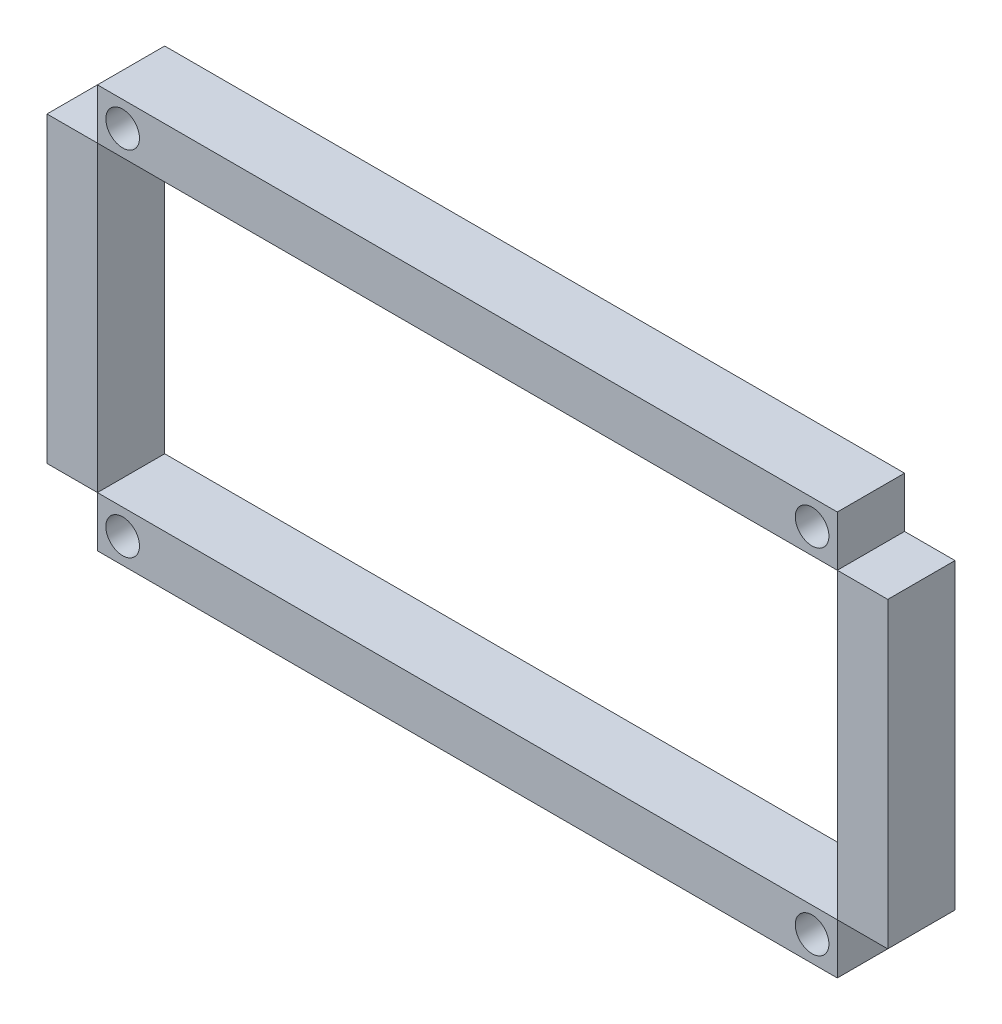
ISO-10303-21;
HEADER;
FILE_DESCRIPTION(('STEP AP214'),'2;1');
FILE_NAME('part.step','',(''),(''),'','','');
FILE_SCHEMA(('AUTOMOTIVE_DESIGN { 1 0 10303 214 1 1 1 1 }'));
ENDSEC;
DATA;
#1=APPLICATION_CONTEXT('core data for automotive mechanical design processes');
#2=APPLICATION_PROTOCOL_DEFINITION('international standard','automotive_design',2000,#1);
#3=PRODUCT_CONTEXT('',#1,'mechanical');
#4=PRODUCT('Part','Part','',(#3));
#5=PRODUCT_RELATED_PRODUCT_CATEGORY('part','',(#4));
#6=PRODUCT_DEFINITION_FORMATION('','',#4);
#7=PRODUCT_DEFINITION_CONTEXT('part definition',#1,'design');
#8=PRODUCT_DEFINITION('design','',#6,#7);
#9=PRODUCT_DEFINITION_SHAPE('','',#8);
#10=(LENGTH_UNIT() NAMED_UNIT(*) SI_UNIT(.MILLI.,.METRE.));
#11=(NAMED_UNIT(*) PLANE_ANGLE_UNIT() SI_UNIT($,.RADIAN.));
#12=(NAMED_UNIT(*) SI_UNIT($,.STERADIAN.) SOLID_ANGLE_UNIT());
#13=UNCERTAINTY_MEASURE_WITH_UNIT(LENGTH_MEASURE(1.E-05),#10,'distance_accuracy_value','');
#14=(GEOMETRIC_REPRESENTATION_CONTEXT(3) GLOBAL_UNCERTAINTY_ASSIGNED_CONTEXT((#13)) GLOBAL_UNIT_ASSIGNED_CONTEXT((#10,
#11,#12)) REPRESENTATION_CONTEXT('',''));
#15=CARTESIAN_POINT('',(0.,0.,0.));
#16=DIRECTION('',(0.,0.,1.));
#17=DIRECTION('',(1.,0.,0.));
#18=AXIS2_PLACEMENT_3D('',#15,#16,#17);
#19=CARTESIAN_POINT('',(380.904830226757,0.,40.));
#20=DIRECTION('',(1.,0.,0.));
#21=DIRECTION('',(0.,0.,-1.));
#22=AXIS2_PLACEMENT_3D('',#19,#20,#21);
#23=PLANE('',#22);
#24=DIRECTION('',(0.,-1.,0.));
#25=VECTOR('',#24,1.);
#26=CARTESIAN_POINT('',(380.904830226757,0.,0.));
#27=LINE('',#26,#25);
#28=CARTESIAN_POINT('',(380.904830226757,-157.632678774636,0.));
#29=VERTEX_POINT('',#28);
#30=CARTESIAN_POINT('',(380.904830226757,-187.632678774636,0.));
#31=VERTEX_POINT('',#30);
#32=EDGE_CURVE('E138',#29,#31,#27,.T.);
#33=ORIENTED_EDGE('',*,*,#32,.F.);
#34=DIRECTION('',(0.,0.,-1.));
#35=VECTOR('',#34,1.);
#36=CARTESIAN_POINT('',(380.904830226757,-157.632678774636,40.));
#37=LINE('',#36,#35);
#38=CARTESIAN_POINT('',(380.904830226757,-157.632678774636,40.));
#39=VERTEX_POINT('',#38);
#40=EDGE_CURVE('E12',#39,#29,#37,.T.);
#41=ORIENTED_EDGE('',*,*,#40,.F.);
#42=DIRECTION('',(0.,-1.,0.));
#43=VECTOR('',#42,1.);
#44=CARTESIAN_POINT('',(380.904830226757,0.,40.));
#45=LINE('',#44,#43);
#46=CARTESIAN_POINT('',(380.904830226757,-187.632678774636,40.));
#47=VERTEX_POINT('',#46);
#48=EDGE_CURVE('E120',#39,#47,#45,.T.);
#49=ORIENTED_EDGE('',*,*,#48,.T.);
#50=DIRECTION('',(0.,0.,-1.));
#51=VECTOR('',#50,1.);
#52=CARTESIAN_POINT('',(380.904830226757,-187.632678774636,40.));
#53=LINE('',#52,#51);
#54=EDGE_CURVE('E97',#47,#31,#53,.T.);
#55=ORIENTED_EDGE('',*,*,#54,.T.);
#56=EDGE_LOOP('',(#33,#41,#49,#55));
#57=FACE_BOUND('',#56,.T.);
#58=ADVANCED_FACE('F56',(#57),#23,.T.);
#59=CARTESIAN_POINT('',(0.,-157.632678774636,40.));
#60=DIRECTION('',(0.,1.,0.));
#61=DIRECTION('',(0.,0.,1.));
#62=AXIS2_PLACEMENT_3D('',#59,#60,#61);
#63=PLANE('',#62);
#64=DIRECTION('',(1.,0.,0.));
#65=VECTOR('',#64,1.);
#66=CARTESIAN_POINT('',(0.,-157.632678774636,0.));
#67=LINE('',#66,#65);
#68=CARTESIAN_POINT('',(-59.0951697732432,-157.632678774636,0.));
#69=VERTEX_POINT('',#68);
#70=EDGE_CURVE('E109',#69,#29,#67,.T.);
#71=ORIENTED_EDGE('',*,*,#70,.F.);
#72=DIRECTION('',(0.,0.,-1.));
#73=VECTOR('',#72,1.);
#74=CARTESIAN_POINT('',(-59.0951697732432,-157.632678774636,40.));
#75=LINE('',#74,#73);
#76=CARTESIAN_POINT('',(-59.0951697732432,-157.632678774636,40.));
#77=VERTEX_POINT('',#76);
#78=EDGE_CURVE('E66',#77,#69,#75,.T.);
#79=ORIENTED_EDGE('',*,*,#78,.F.);
#80=DIRECTION('',(1.,0.,0.));
#81=VECTOR('',#80,1.);
#82=CARTESIAN_POINT('',(0.,-157.632678774636,40.));
#83=LINE('',#82,#81);
#84=EDGE_CURVE('E107',#77,#39,#83,.T.);
#85=ORIENTED_EDGE('',*,*,#84,.T.);
#86=ORIENTED_EDGE('',*,*,#40,.T.);
#87=EDGE_LOOP('',(#71,#79,#85,#86));
#88=FACE_BOUND('',#87,.T.);
#89=ADVANCED_FACE('F105',(#88),#63,.T.);
#90=CARTESIAN_POINT('',(-59.0951697732432,0.,40.));
#91=DIRECTION('',(1.,0.,0.));
#92=DIRECTION('',(0.,0.,-1.));
#93=AXIS2_PLACEMENT_3D('',#90,#91,#92);
#94=PLANE('',#93);
#95=DIRECTION('',(0.,-1.,0.));
#96=VECTOR('',#95,1.);
#97=CARTESIAN_POINT('',(-59.0951697732432,0.,0.));
#98=LINE('',#97,#96);
#99=CARTESIAN_POINT('',(-59.0951697732432,-187.632678774636,0.));
#100=VERTEX_POINT('',#99);
#101=EDGE_CURVE('E143',#69,#100,#98,.T.);
#102=ORIENTED_EDGE('',*,*,#101,.T.);
#103=DIRECTION('',(0.,0.,-1.));
#104=VECTOR('',#103,1.);
#105=CARTESIAN_POINT('',(-59.0951697732432,-187.632678774636,40.));
#106=LINE('',#105,#104);
#107=CARTESIAN_POINT('',(-59.0951697732432,-187.632678774636,40.));
#108=VERTEX_POINT('',#107);
#109=EDGE_CURVE('E113',#108,#100,#106,.T.);
#110=ORIENTED_EDGE('',*,*,#109,.F.);
#111=DIRECTION('',(0.,-1.,0.));
#112=VECTOR('',#111,1.);
#113=CARTESIAN_POINT('',(-59.0951697732432,0.,40.));
#114=LINE('',#113,#112);
#115=EDGE_CURVE('E115',#77,#108,#114,.T.);
#116=ORIENTED_EDGE('',*,*,#115,.F.);
#117=ORIENTED_EDGE('',*,*,#78,.T.);
#118=EDGE_LOOP('',(#102,#110,#116,#117));
#119=FACE_BOUND('',#118,.T.);
#120=ADVANCED_FACE('F116',(#119),#94,.F.);
#121=CARTESIAN_POINT('',(365.904830226757,-172.632678774636,40.));
#122=DIRECTION('',(0.,0.,-1.));
#123=DIRECTION('',(-1.,0.,0.));
#124=AXIS2_PLACEMENT_3D('',#121,#122,#123);
#125=CYLINDRICAL_SURFACE('',#124,9.99999999999998);
#126=CARTESIAN_POINT('',(365.904830226757,-172.632678774636,40.));
#127=DIRECTION('',(0.,0.,1.));
#128=DIRECTION('',(1.,0.,0.));
#129=AXIS2_PLACEMENT_3D('',#126,#127,#128);
#130=CIRCLE('',#129,9.99999999999998);
#131=CARTESIAN_POINT('',(375.904830226757,-172.632678774636,40.));
#132=VERTEX_POINT('',#131);
#133=EDGE_CURVE('E124',#132,#132,#130,.T.);
#134=ORIENTED_EDGE('',*,*,#133,.T.);
#135=EDGE_LOOP('',(#134));
#136=FACE_BOUND('',#135,.T.);
#137=CARTESIAN_POINT('',(365.904830226757,-172.632678774636,0.));
#138=DIRECTION('',(0.,0.,1.));
#139=DIRECTION('',(1.,0.,0.));
#140=AXIS2_PLACEMENT_3D('',#137,#138,#139);
#141=CIRCLE('',#140,9.99999999999998);
#142=CARTESIAN_POINT('',(375.904830226757,-172.632678774636,0.));
#143=VERTEX_POINT('',#142);
#144=EDGE_CURVE('E134',#143,#143,#141,.T.);
#145=ORIENTED_EDGE('',*,*,#144,.F.);
#146=EDGE_LOOP('',(#145));
#147=FACE_BOUND('',#146,.T.);
#148=ADVANCED_FACE('F162',(#136,#147),#125,.F.);
#149=CARTESIAN_POINT('',(-44.0951697732432,-172.632678774636,40.));
#150=DIRECTION('',(0.,0.,-1.));
#151=DIRECTION('',(-1.,0.,0.));
#152=AXIS2_PLACEMENT_3D('',#149,#150,#151);
#153=CYLINDRICAL_SURFACE('',#152,10.);
#154=CARTESIAN_POINT('',(-44.0951697732432,-172.632678774636,40.));
#155=DIRECTION('',(0.,0.,1.));
#156=DIRECTION('',(1.,0.,0.));
#157=AXIS2_PLACEMENT_3D('',#154,#155,#156);
#158=CIRCLE('',#157,10.);
#159=CARTESIAN_POINT('',(-34.0951697732433,-172.632678774636,40.));
#160=VERTEX_POINT('',#159);
#161=EDGE_CURVE('E148',#160,#160,#158,.T.);
#162=ORIENTED_EDGE('',*,*,#161,.T.);
#163=EDGE_LOOP('',(#162));
#164=FACE_BOUND('',#163,.T.);
#165=CARTESIAN_POINT('',(-44.0951697732432,-172.632678774636,0.));
#166=DIRECTION('',(0.,0.,1.));
#167=DIRECTION('',(1.,0.,0.));
#168=AXIS2_PLACEMENT_3D('',#165,#166,#167);
#169=CIRCLE('',#168,10.);
#170=CARTESIAN_POINT('',(-34.0951697732433,-172.632678774636,0.));
#171=VERTEX_POINT('',#170);
#172=EDGE_CURVE('E130',#171,#171,#169,.T.);
#173=ORIENTED_EDGE('',*,*,#172,.F.);
#174=EDGE_LOOP('',(#173));
#175=FACE_BOUND('',#174,.T.);
#176=ADVANCED_FACE('F58',(#164,#175),#153,.F.);
#177=CARTESIAN_POINT('',(0.,-187.632678774636,40.));
#178=DIRECTION('',(0.,1.,0.));
#179=DIRECTION('',(0.,0.,1.));
#180=AXIS2_PLACEMENT_3D('',#177,#178,#179);
#181=PLANE('',#180);
#182=DIRECTION('',(1.,0.,0.));
#183=VECTOR('',#182,1.);
#184=CARTESIAN_POINT('',(0.,-187.632678774636,0.));
#185=LINE('',#184,#183);
#186=EDGE_CURVE('E90',#100,#31,#185,.T.);
#187=ORIENTED_EDGE('',*,*,#186,.T.);
#188=ORIENTED_EDGE('',*,*,#54,.F.);
#189=DIRECTION('',(1.,0.,0.));
#190=VECTOR('',#189,1.);
#191=CARTESIAN_POINT('',(0.,-187.632678774636,40.));
#192=LINE('',#191,#190);
#193=EDGE_CURVE('E74',#108,#47,#192,.T.);
#194=ORIENTED_EDGE('',*,*,#193,.F.);
#195=ORIENTED_EDGE('',*,*,#109,.T.);
#196=EDGE_LOOP('',(#187,#188,#194,#195));
#197=FACE_BOUND('',#196,.T.);
#198=ADVANCED_FACE('F153',(#197),#181,.F.);
#199=CARTESIAN_POINT('',(0.,0.,40.));
#200=DIRECTION('',(0.,0.,1.));
#201=DIRECTION('',(1.,0.,0.));
#202=AXIS2_PLACEMENT_3D('',#199,#200,#201);
#203=PLANE('',#202);
#204=ORIENTED_EDGE('',*,*,#161,.F.);
#205=EDGE_LOOP('',(#204));
#206=FACE_BOUND('',#205,.T.);
#207=ORIENTED_EDGE('',*,*,#133,.F.);
#208=EDGE_LOOP('',(#207));
#209=FACE_BOUND('',#208,.T.);
#210=ORIENTED_EDGE('',*,*,#48,.F.);
#211=ORIENTED_EDGE('',*,*,#84,.F.);
#212=ORIENTED_EDGE('',*,*,#115,.T.);
#213=ORIENTED_EDGE('',*,*,#193,.T.);
#214=EDGE_LOOP('',(#210,#211,#212,#213));
#215=FACE_BOUND('',#214,.T.);
#216=ADVANCED_FACE('F119',(#206,#209,#215),#203,.T.);
#217=CARTESIAN_POINT('',(0.,0.,0.));
#218=DIRECTION('',(0.,0.,1.));
#219=DIRECTION('',(1.,0.,0.));
#220=AXIS2_PLACEMENT_3D('',#217,#218,#219);
#221=PLANE('',#220);
#222=ORIENTED_EDGE('',*,*,#172,.T.);
#223=EDGE_LOOP('',(#222));
#224=FACE_BOUND('',#223,.T.);
#225=ORIENTED_EDGE('',*,*,#144,.T.);
#226=EDGE_LOOP('',(#225));
#227=FACE_BOUND('',#226,.T.);
#228=ORIENTED_EDGE('',*,*,#32,.T.);
#229=ORIENTED_EDGE('',*,*,#186,.F.);
#230=ORIENTED_EDGE('',*,*,#101,.F.);
#231=ORIENTED_EDGE('',*,*,#70,.T.);
#232=EDGE_LOOP('',(#228,#229,#230,#231));
#233=FACE_BOUND('',#232,.T.);
#234=ADVANCED_FACE('F154',(#224,#227,#233),#221,.F.);
#235=CLOSED_SHELL('',(#58,#89,#120,#148,#176,#198,#216,#234));
#236=MANIFOLD_SOLID_BREP('B2',#235);
#237=CARTESIAN_POINT('',(410.904830226757,-1.26721112068732E-13,40.));
#238=DIRECTION('',(1.,0.,0.));
#239=DIRECTION('',(0.,1.,0.));
#240=AXIS2_PLACEMENT_3D('',#237,#238,#239);
#241=PLANE('',#240);
#242=DIRECTION('',(0.,-1.,0.));
#243=VECTOR('',#242,1.);
#244=CARTESIAN_POINT('',(410.904830226757,-1.26721112068732E-13,0.));
#245=LINE('',#244,#243);
#246=CARTESIAN_POINT('',(410.904830226757,22.367321225364,0.));
#247=VERTEX_POINT('',#246);
#248=CARTESIAN_POINT('',(410.904830226757,-157.632678774636,0.));
#249=VERTEX_POINT('',#248);
#250=EDGE_CURVE('E327',#247,#249,#245,.T.);
#251=ORIENTED_EDGE('',*,*,#250,.F.);
#252=DIRECTION('',(0.,0.,-1.));
#253=VECTOR('',#252,1.);
#254=CARTESIAN_POINT('',(410.904830226757,22.367321225364,40.));
#255=LINE('',#254,#253);
#256=CARTESIAN_POINT('',(410.904830226757,22.367321225364,40.));
#257=VERTEX_POINT('',#256);
#258=EDGE_CURVE('E54',#257,#247,#255,.T.);
#259=ORIENTED_EDGE('',*,*,#258,.F.);
#260=DIRECTION('',(0.,-1.,0.));
#261=VECTOR('',#260,1.);
#262=CARTESIAN_POINT('',(410.904830226757,-1.26721112068732E-13,40.));
#263=LINE('',#262,#261);
#264=CARTESIAN_POINT('',(410.904830226757,-157.632678774636,40.));
#265=VERTEX_POINT('',#264);
#266=EDGE_CURVE('E321',#257,#265,#263,.T.);
#267=ORIENTED_EDGE('',*,*,#266,.T.);
#268=DIRECTION('',(0.,0.,-1.));
#269=VECTOR('',#268,1.);
#270=CARTESIAN_POINT('',(410.904830226757,-157.632678774636,40.));
#271=LINE('',#270,#269);
#272=EDGE_CURVE('E302',#265,#249,#271,.T.);
#273=ORIENTED_EDGE('',*,*,#272,.T.);
#274=EDGE_LOOP('',(#251,#259,#267,#273));
#275=FACE_BOUND('',#274,.T.);
#276=ADVANCED_FACE('F264',(#275),#241,.T.);
#277=CARTESIAN_POINT('',(0.,22.367321225364,40.));
#278=DIRECTION('',(0.,1.,0.));
#279=DIRECTION('',(0.,0.,1.));
#280=AXIS2_PLACEMENT_3D('',#277,#278,#279);
#281=PLANE('',#280);
#282=DIRECTION('',(1.,0.,0.));
#283=VECTOR('',#282,1.);
#284=CARTESIAN_POINT('',(0.,22.367321225364,0.));
#285=LINE('',#284,#283);
#286=CARTESIAN_POINT('',(380.904830226757,22.367321225364,0.));
#287=VERTEX_POINT('',#286);
#288=EDGE_CURVE('E315',#287,#247,#285,.T.);
#289=ORIENTED_EDGE('',*,*,#288,.F.);
#290=DIRECTION('',(0.,0.,-1.));
#291=VECTOR('',#290,1.);
#292=CARTESIAN_POINT('',(380.904830226757,22.367321225364,40.));
#293=LINE('',#292,#291);
#294=CARTESIAN_POINT('',(380.904830226757,22.367321225364,40.));
#295=VERTEX_POINT('',#294);
#296=EDGE_CURVE('E272',#295,#287,#293,.T.);
#297=ORIENTED_EDGE('',*,*,#296,.F.);
#298=DIRECTION('',(1.,0.,0.));
#299=VECTOR('',#298,1.);
#300=CARTESIAN_POINT('',(0.,22.367321225364,40.));
#301=LINE('',#300,#299);
#302=EDGE_CURVE('E313',#295,#257,#301,.T.);
#303=ORIENTED_EDGE('',*,*,#302,.T.);
#304=ORIENTED_EDGE('',*,*,#258,.T.);
#305=EDGE_LOOP('',(#289,#297,#303,#304));
#306=FACE_BOUND('',#305,.T.);
#307=ADVANCED_FACE('F311',(#306),#281,.T.);
#308=CARTESIAN_POINT('',(380.904830226757,1.17469253530189E-13,40.));
#309=DIRECTION('',(1.,0.,0.));
#310=DIRECTION('',(0.,1.,0.));
#311=AXIS2_PLACEMENT_3D('',#308,#309,#310);
#312=PLANE('',#311);
#313=DIRECTION('',(0.,-1.,0.));
#314=VECTOR('',#313,1.);
#315=CARTESIAN_POINT('',(380.904830226757,1.17469253530189E-13,0.));
#316=LINE('',#315,#314);
#317=CARTESIAN_POINT('',(380.904830226757,-157.632678774636,0.));
#318=VERTEX_POINT('',#317);
#319=EDGE_CURVE('E295',#287,#318,#316,.T.);
#320=ORIENTED_EDGE('',*,*,#319,.T.);
#321=DIRECTION('',(0.,0.,-1.));
#322=VECTOR('',#321,1.);
#323=CARTESIAN_POINT('',(380.904830226757,-157.632678774636,40.));
#324=LINE('',#323,#322);
#325=CARTESIAN_POINT('',(380.904830226757,-157.632678774636,40.));
#326=VERTEX_POINT('',#325);
#327=EDGE_CURVE('E316',#326,#318,#324,.T.);
#328=ORIENTED_EDGE('',*,*,#327,.F.);
#329=DIRECTION('',(0.,-1.,0.));
#330=VECTOR('',#329,1.);
#331=CARTESIAN_POINT('',(380.904830226757,1.17469253530189E-13,40.));
#332=LINE('',#331,#330);
#333=EDGE_CURVE('E317',#295,#326,#332,.T.);
#334=ORIENTED_EDGE('',*,*,#333,.F.);
#335=ORIENTED_EDGE('',*,*,#296,.T.);
#336=EDGE_LOOP('',(#320,#328,#334,#335));
#337=FACE_BOUND('',#336,.T.);
#338=ADVANCED_FACE('F318',(#337),#312,.F.);
#339=CARTESIAN_POINT('',(0.,-157.632678774636,40.));
#340=DIRECTION('',(0.,1.,0.));
#341=DIRECTION('',(0.,0.,1.));
#342=AXIS2_PLACEMENT_3D('',#339,#340,#341);
#343=PLANE('',#342);
#344=DIRECTION('',(1.,0.,0.));
#345=VECTOR('',#344,1.);
#346=CARTESIAN_POINT('',(0.,-157.632678774636,0.));
#347=LINE('',#346,#345);
#348=EDGE_CURVE('E323',#318,#249,#347,.T.);
#349=ORIENTED_EDGE('',*,*,#348,.T.);
#350=ORIENTED_EDGE('',*,*,#272,.F.);
#351=DIRECTION('',(1.,0.,0.));
#352=VECTOR('',#351,1.);
#353=CARTESIAN_POINT('',(0.,-157.632678774636,40.));
#354=LINE('',#353,#352);
#355=EDGE_CURVE('E280',#326,#265,#354,.T.);
#356=ORIENTED_EDGE('',*,*,#355,.F.);
#357=ORIENTED_EDGE('',*,*,#327,.T.);
#358=EDGE_LOOP('',(#349,#350,#356,#357));
#359=FACE_BOUND('',#358,.T.);
#360=ADVANCED_FACE('F336',(#359),#343,.F.);
#361=CARTESIAN_POINT('',(0.,0.,40.));
#362=DIRECTION('',(0.,0.,1.));
#363=DIRECTION('',(1.,0.,0.));
#364=AXIS2_PLACEMENT_3D('',#361,#362,#363);
#365=PLANE('',#364);
#366=ORIENTED_EDGE('',*,*,#266,.F.);
#367=ORIENTED_EDGE('',*,*,#302,.F.);
#368=ORIENTED_EDGE('',*,*,#333,.T.);
#369=ORIENTED_EDGE('',*,*,#355,.T.);
#370=EDGE_LOOP('',(#366,#367,#368,#369));
#371=FACE_BOUND('',#370,.T.);
#372=ADVANCED_FACE('F320',(#371),#365,.T.);
#373=CARTESIAN_POINT('',(0.,0.,0.));
#374=DIRECTION('',(0.,0.,1.));
#375=DIRECTION('',(1.,0.,0.));
#376=AXIS2_PLACEMENT_3D('',#373,#374,#375);
#377=PLANE('',#376);
#378=ORIENTED_EDGE('',*,*,#250,.T.);
#379=ORIENTED_EDGE('',*,*,#348,.F.);
#380=ORIENTED_EDGE('',*,*,#319,.F.);
#381=ORIENTED_EDGE('',*,*,#288,.T.);
#382=EDGE_LOOP('',(#378,#379,#380,#381));
#383=FACE_BOUND('',#382,.T.);
#384=ADVANCED_FACE('F338',(#383),#377,.F.);
#385=CLOSED_SHELL('',(#276,#307,#338,#360,#372,#384));
#386=MANIFOLD_SOLID_BREP('B6',#385);
#387=CARTESIAN_POINT('',(0.,-157.632678774636,40.));
#388=DIRECTION('',(0.,1.,0.));
#389=DIRECTION('',(0.,0.,1.));
#390=AXIS2_PLACEMENT_3D('',#387,#388,#389);
#391=PLANE('',#390);
#392=DIRECTION('',(1.,0.,0.));
#393=VECTOR('',#392,1.);
#394=CARTESIAN_POINT('',(0.,-157.632678774636,0.));
#395=LINE('',#394,#393);
#396=CARTESIAN_POINT('',(-89.0951697732432,-157.632678774636,0.));
#397=VERTEX_POINT('',#396);
#398=CARTESIAN_POINT('',(-59.0951697732432,-157.632678774636,0.));
#399=VERTEX_POINT('',#398);
#400=EDGE_CURVE('E472',#397,#399,#395,.T.);
#401=ORIENTED_EDGE('',*,*,#400,.T.);
#402=DIRECTION('',(0.,0.,-1.));
#403=VECTOR('',#402,1.);
#404=CARTESIAN_POINT('',(-59.0951697732432,-157.632678774636,40.));
#405=LINE('',#404,#403);
#406=CARTESIAN_POINT('',(-59.0951697732432,-157.632678774636,40.));
#407=VERTEX_POINT('',#406);
#408=EDGE_CURVE('E262',#407,#399,#405,.T.);
#409=ORIENTED_EDGE('',*,*,#408,.F.);
#410=DIRECTION('',(1.,0.,0.));
#411=VECTOR('',#410,1.);
#412=CARTESIAN_POINT('',(0.,-157.632678774636,40.));
#413=LINE('',#412,#411);
#414=CARTESIAN_POINT('',(-89.0951697732432,-157.632678774636,40.));
#415=VERTEX_POINT('',#414);
#416=EDGE_CURVE('E458',#415,#407,#413,.T.);
#417=ORIENTED_EDGE('',*,*,#416,.F.);
#418=DIRECTION('',(0.,0.,-1.));
#419=VECTOR('',#418,1.);
#420=CARTESIAN_POINT('',(-89.0951697732432,-157.632678774636,40.));
#421=LINE('',#420,#419);
#422=EDGE_CURVE('E425',#415,#397,#421,.T.);
#423=ORIENTED_EDGE('',*,*,#422,.T.);
#424=EDGE_LOOP('',(#401,#409,#417,#423));
#425=FACE_BOUND('',#424,.T.);
#426=ADVANCED_FACE('F409',(#425),#391,.F.);
#427=CARTESIAN_POINT('',(-59.0951697732432,0.,40.));
#428=DIRECTION('',(-1.,0.,0.));
#429=DIRECTION('',(0.,-1.,0.));
#430=AXIS2_PLACEMENT_3D('',#427,#428,#429);
#431=PLANE('',#430);
#432=DIRECTION('',(0.,1.,0.));
#433=VECTOR('',#432,1.);
#434=CARTESIAN_POINT('',(-59.0951697732432,0.,0.));
#435=LINE('',#434,#433);
#436=CARTESIAN_POINT('',(-59.0951697732432,22.367321225364,0.));
#437=VERTEX_POINT('',#436);
#438=EDGE_CURVE('E463',#399,#437,#435,.T.);
#439=ORIENTED_EDGE('',*,*,#438,.T.);
#440=DIRECTION('',(0.,0.,-1.));
#441=VECTOR('',#440,1.);
#442=CARTESIAN_POINT('',(-59.0951697732432,22.367321225364,40.));
#443=LINE('',#442,#441);
#444=CARTESIAN_POINT('',(-59.0951697732432,22.367321225364,40.));
#445=VERTEX_POINT('',#444);
#446=EDGE_CURVE('E417',#445,#437,#443,.T.);
#447=ORIENTED_EDGE('',*,*,#446,.F.);
#448=DIRECTION('',(0.,1.,0.));
#449=VECTOR('',#448,1.);
#450=CARTESIAN_POINT('',(-59.0951697732432,0.,40.));
#451=LINE('',#450,#449);
#452=EDGE_CURVE('E450',#407,#445,#451,.T.);
#453=ORIENTED_EDGE('',*,*,#452,.F.);
#454=ORIENTED_EDGE('',*,*,#408,.T.);
#455=EDGE_LOOP('',(#439,#447,#453,#454));
#456=FACE_BOUND('',#455,.T.);
#457=ADVANCED_FACE('F462',(#456),#431,.F.);
#458=CARTESIAN_POINT('',(0.,22.367321225364,40.));
#459=DIRECTION('',(0.,1.,0.));
#460=DIRECTION('',(0.,0.,1.));
#461=AXIS2_PLACEMENT_3D('',#458,#459,#460);
#462=PLANE('',#461);
#463=DIRECTION('',(1.,0.,0.));
#464=VECTOR('',#463,1.);
#465=CARTESIAN_POINT('',(0.,22.367321225364,0.));
#466=LINE('',#465,#464);
#467=CARTESIAN_POINT('',(-89.0951697732432,22.367321225364,0.));
#468=VERTEX_POINT('',#467);
#469=EDGE_CURVE('E475',#468,#437,#466,.T.);
#470=ORIENTED_EDGE('',*,*,#469,.F.);
#471=DIRECTION('',(0.,0.,-1.));
#472=VECTOR('',#471,1.);
#473=CARTESIAN_POINT('',(-89.0951697732432,22.367321225364,40.));
#474=LINE('',#473,#472);
#475=CARTESIAN_POINT('',(-89.0951697732432,22.367321225364,40.));
#476=VERTEX_POINT('',#475);
#477=EDGE_CURVE('E439',#476,#468,#474,.T.);
#478=ORIENTED_EDGE('',*,*,#477,.F.);
#479=DIRECTION('',(1.,0.,0.));
#480=VECTOR('',#479,1.);
#481=CARTESIAN_POINT('',(0.,22.367321225364,40.));
#482=LINE('',#481,#480);
#483=EDGE_CURVE('E457',#476,#445,#482,.T.);
#484=ORIENTED_EDGE('',*,*,#483,.T.);
#485=ORIENTED_EDGE('',*,*,#446,.T.);
#486=EDGE_LOOP('',(#470,#478,#484,#485));
#487=FACE_BOUND('',#486,.T.);
#488=ADVANCED_FACE('F466',(#487),#462,.T.);
#489=CARTESIAN_POINT('',(-89.0951697732432,0.,40.));
#490=DIRECTION('',(-1.,0.,0.));
#491=DIRECTION('',(0.,0.,1.));
#492=AXIS2_PLACEMENT_3D('',#489,#490,#491);
#493=PLANE('',#492);
#494=DIRECTION('',(0.,1.,0.));
#495=VECTOR('',#494,1.);
#496=CARTESIAN_POINT('',(-89.0951697732432,0.,0.));
#497=LINE('',#496,#495);
#498=EDGE_CURVE('E477',#397,#468,#497,.T.);
#499=ORIENTED_EDGE('',*,*,#498,.F.);
#500=ORIENTED_EDGE('',*,*,#422,.F.);
#501=DIRECTION('',(0.,1.,0.));
#502=VECTOR('',#501,1.);
#503=CARTESIAN_POINT('',(-89.0951697732432,0.,40.));
#504=LINE('',#503,#502);
#505=EDGE_CURVE('E467',#415,#476,#504,.T.);
#506=ORIENTED_EDGE('',*,*,#505,.T.);
#507=ORIENTED_EDGE('',*,*,#477,.T.);
#508=EDGE_LOOP('',(#499,#500,#506,#507));
#509=FACE_BOUND('',#508,.T.);
#510=ADVANCED_FACE('F483',(#509),#493,.T.);
#511=CARTESIAN_POINT('',(0.,0.,40.));
#512=DIRECTION('',(0.,0.,1.));
#513=DIRECTION('',(1.,0.,0.));
#514=AXIS2_PLACEMENT_3D('',#511,#512,#513);
#515=PLANE('',#514);
#516=ORIENTED_EDGE('',*,*,#416,.T.);
#517=ORIENTED_EDGE('',*,*,#452,.T.);
#518=ORIENTED_EDGE('',*,*,#483,.F.);
#519=ORIENTED_EDGE('',*,*,#505,.F.);
#520=EDGE_LOOP('',(#516,#517,#518,#519));
#521=FACE_BOUND('',#520,.T.);
#522=ADVANCED_FACE('F454',(#521),#515,.T.);
#523=CARTESIAN_POINT('',(0.,0.,0.));
#524=DIRECTION('',(0.,0.,1.));
#525=DIRECTION('',(1.,0.,0.));
#526=AXIS2_PLACEMENT_3D('',#523,#524,#525);
#527=PLANE('',#526);
#528=ORIENTED_EDGE('',*,*,#400,.F.);
#529=ORIENTED_EDGE('',*,*,#498,.T.);
#530=ORIENTED_EDGE('',*,*,#469,.T.);
#531=ORIENTED_EDGE('',*,*,#438,.F.);
#532=EDGE_LOOP('',(#528,#529,#530,#531));
#533=FACE_BOUND('',#532,.T.);
#534=ADVANCED_FACE('F482',(#533),#527,.F.);
#535=CLOSED_SHELL('',(#426,#457,#488,#510,#522,#534));
#536=MANIFOLD_SOLID_BREP('B48',#535);
#537=CARTESIAN_POINT('',(0.,22.367321225364,40.));
#538=DIRECTION('',(0.,1.,0.));
#539=DIRECTION('',(-1.,0.,0.));
#540=AXIS2_PLACEMENT_3D('',#537,#538,#539);
#541=PLANE('',#540);
#542=DIRECTION('',(1.,0.,0.));
#543=VECTOR('',#542,1.);
#544=CARTESIAN_POINT('',(0.,22.367321225364,0.));
#545=LINE('',#544,#543);
#546=CARTESIAN_POINT('',(-59.0951697732432,22.367321225364,0.));
#547=VERTEX_POINT('',#546);
#548=CARTESIAN_POINT('',(380.904830226757,22.367321225364,0.));
#549=VERTEX_POINT('',#548);
#550=EDGE_CURVE('E615',#547,#549,#545,.T.);
#551=ORIENTED_EDGE('',*,*,#550,.T.);
#552=DIRECTION('',(0.,0.,-1.));
#553=VECTOR('',#552,1.);
#554=CARTESIAN_POINT('',(380.904830226757,22.367321225364,40.));
#555=LINE('',#554,#553);
#556=CARTESIAN_POINT('',(380.904830226757,22.367321225364,40.));
#557=VERTEX_POINT('',#556);
#558=EDGE_CURVE('E407',#557,#549,#555,.T.);
#559=ORIENTED_EDGE('',*,*,#558,.F.);
#560=DIRECTION('',(1.,0.,0.));
#561=VECTOR('',#560,1.);
#562=CARTESIAN_POINT('',(0.,22.367321225364,40.));
#563=LINE('',#562,#561);
#564=CARTESIAN_POINT('',(-59.0951697732432,22.367321225364,40.));
#565=VERTEX_POINT('',#564);
#566=EDGE_CURVE('E595',#565,#557,#563,.T.);
#567=ORIENTED_EDGE('',*,*,#566,.F.);
#568=DIRECTION('',(0.,0.,-1.));
#569=VECTOR('',#568,1.);
#570=CARTESIAN_POINT('',(-59.0951697732432,22.367321225364,40.));
#571=LINE('',#570,#569);
#572=EDGE_CURVE('E562',#565,#547,#571,.T.);
#573=ORIENTED_EDGE('',*,*,#572,.T.);
#574=EDGE_LOOP('',(#551,#559,#567,#573));
#575=FACE_BOUND('',#574,.T.);
#576=ADVANCED_FACE('F545',(#575),#541,.F.);
#577=CARTESIAN_POINT('',(380.904830226757,0.,40.));
#578=DIRECTION('',(-1.,0.,0.));
#579=DIRECTION('',(0.,0.,1.));
#580=AXIS2_PLACEMENT_3D('',#577,#578,#579);
#581=PLANE('',#580);
#582=DIRECTION('',(0.,1.,0.));
#583=VECTOR('',#582,1.);
#584=CARTESIAN_POINT('',(380.904830226757,0.,0.));
#585=LINE('',#584,#583);
#586=CARTESIAN_POINT('',(380.904830226757,52.367321225364,0.));
#587=VERTEX_POINT('',#586);
#588=EDGE_CURVE('E600',#549,#587,#585,.T.);
#589=ORIENTED_EDGE('',*,*,#588,.T.);
#590=DIRECTION('',(0.,0.,-1.));
#591=VECTOR('',#590,1.);
#592=CARTESIAN_POINT('',(380.904830226757,52.367321225364,40.));
#593=LINE('',#592,#591);
#594=CARTESIAN_POINT('',(380.904830226757,52.367321225364,40.));
#595=VERTEX_POINT('',#594);
#596=EDGE_CURVE('E554',#595,#587,#593,.T.);
#597=ORIENTED_EDGE('',*,*,#596,.F.);
#598=DIRECTION('',(0.,1.,0.));
#599=VECTOR('',#598,1.);
#600=CARTESIAN_POINT('',(380.904830226757,0.,40.));
#601=LINE('',#600,#599);
#602=EDGE_CURVE('E587',#557,#595,#601,.T.);
#603=ORIENTED_EDGE('',*,*,#602,.F.);
#604=ORIENTED_EDGE('',*,*,#558,.T.);
#605=EDGE_LOOP('',(#589,#597,#603,#604));
#606=FACE_BOUND('',#605,.T.);
#607=ADVANCED_FACE('F599',(#606),#581,.F.);
#608=CARTESIAN_POINT('',(0.,52.367321225364,40.));
#609=DIRECTION('',(0.,1.,0.));
#610=DIRECTION('',(-1.,0.,0.));
#611=AXIS2_PLACEMENT_3D('',#608,#609,#610);
#612=PLANE('',#611);
#613=DIRECTION('',(1.,0.,0.));
#614=VECTOR('',#613,1.);
#615=CARTESIAN_POINT('',(0.,52.367321225364,0.));
#616=LINE('',#615,#614);
#617=CARTESIAN_POINT('',(-59.0951697732432,52.367321225364,0.));
#618=VERTEX_POINT('',#617);
#619=EDGE_CURVE('E618',#618,#587,#616,.T.);
#620=ORIENTED_EDGE('',*,*,#619,.F.);
#621=DIRECTION('',(0.,0.,-1.));
#622=VECTOR('',#621,1.);
#623=CARTESIAN_POINT('',(-59.0951697732432,52.367321225364,40.));
#624=LINE('',#623,#622);
#625=CARTESIAN_POINT('',(-59.0951697732432,52.367321225364,40.));
#626=VERTEX_POINT('',#625);
#627=EDGE_CURVE('E576',#626,#618,#624,.T.);
#628=ORIENTED_EDGE('',*,*,#627,.F.);
#629=DIRECTION('',(1.,0.,0.));
#630=VECTOR('',#629,1.);
#631=CARTESIAN_POINT('',(0.,52.367321225364,40.));
#632=LINE('',#631,#630);
#633=EDGE_CURVE('E594',#626,#595,#632,.T.);
#634=ORIENTED_EDGE('',*,*,#633,.T.);
#635=ORIENTED_EDGE('',*,*,#596,.T.);
#636=EDGE_LOOP('',(#620,#628,#634,#635));
#637=FACE_BOUND('',#636,.T.);
#638=ADVANCED_FACE('F603',(#637),#612,.T.);
#639=CARTESIAN_POINT('',(-44.0951697732432,37.367321225364,40.));
#640=DIRECTION('',(0.,0.,-1.));
#641=DIRECTION('',(-1.,0.,0.));
#642=AXIS2_PLACEMENT_3D('',#639,#640,#641);
#643=CYLINDRICAL_SURFACE('',#642,9.99999999999999);
#644=CARTESIAN_POINT('',(-44.0951697732432,37.367321225364,40.));
#645=DIRECTION('',(0.,0.,1.));
#646=DIRECTION('',(1.,0.,0.));
#647=AXIS2_PLACEMENT_3D('',#644,#645,#646);
#648=CIRCLE('',#647,9.99999999999999);
#649=CARTESIAN_POINT('',(-34.0951697732433,37.367321225364,40.));
#650=VERTEX_POINT('',#649);
#651=EDGE_CURVE('E627',#650,#650,#648,.T.);
#652=ORIENTED_EDGE('',*,*,#651,.T.);
#653=EDGE_LOOP('',(#652));
#654=FACE_BOUND('',#653,.T.);
#655=CARTESIAN_POINT('',(-44.0951697732432,37.367321225364,0.));
#656=DIRECTION('',(0.,0.,1.));
#657=DIRECTION('',(1.,0.,0.));
#658=AXIS2_PLACEMENT_3D('',#655,#656,#657);
#659=CIRCLE('',#658,9.99999999999999);
#660=CARTESIAN_POINT('',(-34.0951697732433,37.367321225364,0.));
#661=VERTEX_POINT('',#660);
#662=EDGE_CURVE('E612',#661,#661,#659,.T.);
#663=ORIENTED_EDGE('',*,*,#662,.F.);
#664=EDGE_LOOP('',(#663));
#665=FACE_BOUND('',#664,.T.);
#666=ADVANCED_FACE('F635',(#654,#665),#643,.F.);
#667=CARTESIAN_POINT('',(365.904830226757,37.367321225364,40.));
#668=DIRECTION('',(0.,0.,-1.));
#669=DIRECTION('',(-1.,0.,0.));
#670=AXIS2_PLACEMENT_3D('',#667,#668,#669);
#671=CYLINDRICAL_SURFACE('',#670,9.99999999999998);
#672=CARTESIAN_POINT('',(365.904830226757,37.367321225364,40.));
#673=DIRECTION('',(0.,0.,1.));
#674=DIRECTION('',(1.,0.,0.));
#675=AXIS2_PLACEMENT_3D('',#672,#673,#674);
#676=CIRCLE('',#675,9.99999999999998);
#677=CARTESIAN_POINT('',(375.904830226757,37.367321225364,40.));
#678=VERTEX_POINT('',#677);
#679=EDGE_CURVE('E623',#678,#678,#676,.T.);
#680=ORIENTED_EDGE('',*,*,#679,.T.);
#681=EDGE_LOOP('',(#680));
#682=FACE_BOUND('',#681,.T.);
#683=CARTESIAN_POINT('',(365.904830226757,37.367321225364,0.));
#684=DIRECTION('',(0.,0.,1.));
#685=DIRECTION('',(1.,0.,0.));
#686=AXIS2_PLACEMENT_3D('',#683,#684,#685);
#687=CIRCLE('',#686,9.99999999999998);
#688=CARTESIAN_POINT('',(375.904830226757,37.367321225364,0.));
#689=VERTEX_POINT('',#688);
#690=EDGE_CURVE('E609',#689,#689,#687,.T.);
#691=ORIENTED_EDGE('',*,*,#690,.F.);
#692=EDGE_LOOP('',(#691));
#693=FACE_BOUND('',#692,.T.);
#694=ADVANCED_FACE('F547',(#682,#693),#671,.F.);
#695=CARTESIAN_POINT('',(-59.0951697732432,0.,40.));
#696=DIRECTION('',(-1.,0.,0.));
#697=DIRECTION('',(0.,-1.,0.));
#698=AXIS2_PLACEMENT_3D('',#695,#696,#697);
#699=PLANE('',#698);
#700=DIRECTION('',(0.,1.,0.));
#701=VECTOR('',#700,1.);
#702=CARTESIAN_POINT('',(-59.0951697732432,0.,0.));
#703=LINE('',#702,#701);
#704=EDGE_CURVE('E620',#547,#618,#703,.T.);
#705=ORIENTED_EDGE('',*,*,#704,.F.);
#706=ORIENTED_EDGE('',*,*,#572,.F.);
#707=DIRECTION('',(0.,1.,0.));
#708=VECTOR('',#707,1.);
#709=CARTESIAN_POINT('',(-59.0951697732432,0.,40.));
#710=LINE('',#709,#708);
#711=EDGE_CURVE('E604',#565,#626,#710,.T.);
#712=ORIENTED_EDGE('',*,*,#711,.T.);
#713=ORIENTED_EDGE('',*,*,#627,.T.);
#714=EDGE_LOOP('',(#705,#706,#712,#713));
#715=FACE_BOUND('',#714,.T.);
#716=ADVANCED_FACE('F640',(#715),#699,.T.);
#717=CARTESIAN_POINT('',(0.,0.,40.));
#718=DIRECTION('',(0.,0.,1.));
#719=DIRECTION('',(1.,0.,0.));
#720=AXIS2_PLACEMENT_3D('',#717,#718,#719);
#721=PLANE('',#720);
#722=ORIENTED_EDGE('',*,*,#679,.F.);
#723=EDGE_LOOP('',(#722));
#724=FACE_BOUND('',#723,.T.);
#725=ORIENTED_EDGE('',*,*,#651,.F.);
#726=EDGE_LOOP('',(#725));
#727=FACE_BOUND('',#726,.T.);
#728=ORIENTED_EDGE('',*,*,#566,.T.);
#729=ORIENTED_EDGE('',*,*,#602,.T.);
#730=ORIENTED_EDGE('',*,*,#633,.F.);
#731=ORIENTED_EDGE('',*,*,#711,.F.);
#732=EDGE_LOOP('',(#728,#729,#730,#731));
#733=FACE_BOUND('',#732,.T.);
#734=ADVANCED_FACE('F591',(#724,#727,#733),#721,.T.);
#735=CARTESIAN_POINT('',(0.,0.,0.));
#736=DIRECTION('',(0.,0.,1.));
#737=DIRECTION('',(1.,0.,0.));
#738=AXIS2_PLACEMENT_3D('',#735,#736,#737);
#739=PLANE('',#738);
#740=ORIENTED_EDGE('',*,*,#690,.T.);
#741=EDGE_LOOP('',(#740));
#742=FACE_BOUND('',#741,.T.);
#743=ORIENTED_EDGE('',*,*,#662,.T.);
#744=EDGE_LOOP('',(#743));
#745=FACE_BOUND('',#744,.T.);
#746=ORIENTED_EDGE('',*,*,#550,.F.);
#747=ORIENTED_EDGE('',*,*,#704,.T.);
#748=ORIENTED_EDGE('',*,*,#619,.T.);
#749=ORIENTED_EDGE('',*,*,#588,.F.);
#750=EDGE_LOOP('',(#746,#747,#748,#749));
#751=FACE_BOUND('',#750,.T.);
#752=ADVANCED_FACE('F639',(#742,#745,#751),#739,.F.);
#753=CLOSED_SHELL('',(#576,#607,#638,#666,#694,#716,#734,#752));
#754=MANIFOLD_SOLID_BREP('B256',#753);
#755=ADVANCED_BREP_SHAPE_REPRESENTATION('',(#18,#236,#386,#536,#754),#14);
#756=SHAPE_DEFINITION_REPRESENTATION(#9,#755);
ENDSEC;
END-ISO-10303-21;
